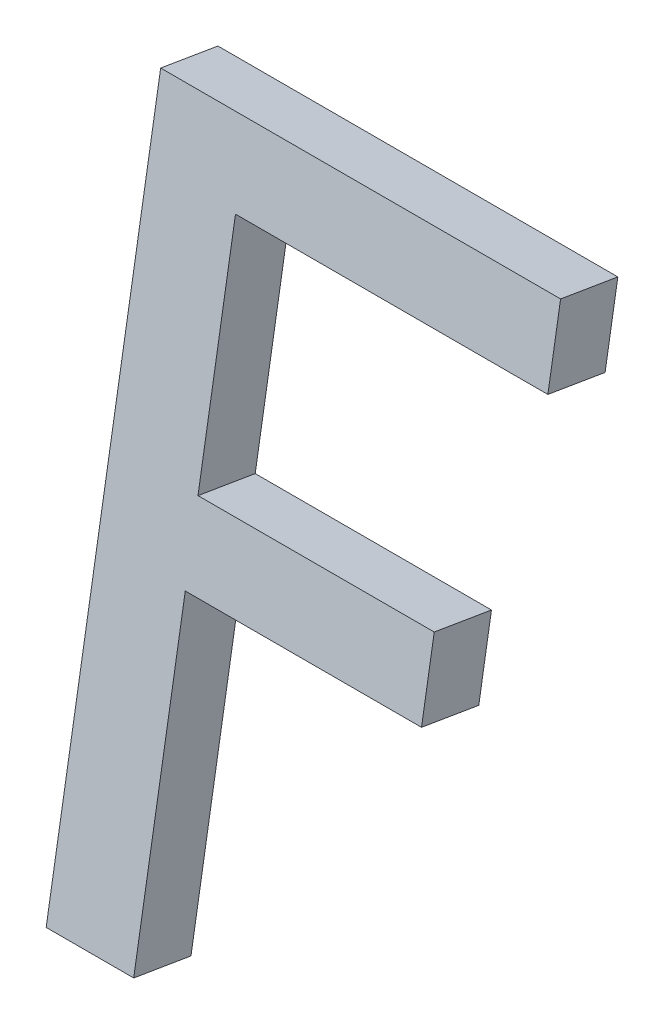
ISO-10303-21;
HEADER;
FILE_DESCRIPTION(('STEP AP214'),'2;1');
FILE_NAME('part.step','',(''),(''),'','','');
FILE_SCHEMA(('AUTOMOTIVE_DESIGN { 1 0 10303 214 1 1 1 1 }'));
ENDSEC;
DATA;
#1=APPLICATION_CONTEXT('core data for automotive mechanical design processes');
#2=APPLICATION_PROTOCOL_DEFINITION('international standard','automotive_design',2000,#1);
#3=PRODUCT_CONTEXT('',#1,'mechanical');
#4=PRODUCT('Part','Part','',(#3));
#5=PRODUCT_RELATED_PRODUCT_CATEGORY('part','',(#4));
#6=PRODUCT_DEFINITION_FORMATION('','',#4);
#7=PRODUCT_DEFINITION_CONTEXT('part definition',#1,'design');
#8=PRODUCT_DEFINITION('design','',#6,#7);
#9=PRODUCT_DEFINITION_SHAPE('','',#8);
#10=(LENGTH_UNIT() NAMED_UNIT(*) SI_UNIT(.MILLI.,.METRE.));
#11=(NAMED_UNIT(*) PLANE_ANGLE_UNIT() SI_UNIT($,.RADIAN.));
#12=(NAMED_UNIT(*) SI_UNIT($,.STERADIAN.) SOLID_ANGLE_UNIT());
#13=UNCERTAINTY_MEASURE_WITH_UNIT(LENGTH_MEASURE(1.E-05),#10,'distance_accuracy_value','');
#14=(GEOMETRIC_REPRESENTATION_CONTEXT(3) GLOBAL_UNCERTAINTY_ASSIGNED_CONTEXT((#13)) GLOBAL_UNIT_ASSIGNED_CONTEXT((#10,
#11,#12)) REPRESENTATION_CONTEXT('',''));
#15=CARTESIAN_POINT('',(0.,0.,0.));
#16=DIRECTION('',(0.,0.,1.));
#17=DIRECTION('',(1.,0.,0.));
#18=AXIS2_PLACEMENT_3D('',#15,#16,#17);
#19=CARTESIAN_POINT('',(1227.04250559284,1142.41768553082,1243.97176701001));
#20=DIRECTION('',(0.,0.986393923832144,-0.164398987305355));
#21=DIRECTION('',(0.,0.164398987305355,0.986393923832144));
#22=AXIS2_PLACEMENT_3D('',#19,#20,#21);
#23=PLANE('',#22);
#24=CARTESIAN_POINT('',(1227.04250559284,1141.5956905943,1239.03979739085));
#25=CARTESIAN_POINT('',(1236.01230425056,1141.5956905943,1239.03979739085));
#26=CARTESIAN_POINT('',(1244.98210290827,1141.5956905943,1239.03979739085));
#27=CARTESIAN_POINT('',(1253.95190156599,1141.5956905943,1239.03979739085));
#28=B_SPLINE_CURVE_WITH_KNOTS('',3,(#24,#25,#26,#27),.UNSPECIFIED.,.F.,.F.,(4,4),(0.,
0.117198004559893),.UNSPECIFIED.);
#29=CARTESIAN_POINT('',(1227.04250559284,1141.5956905943,1239.03979739085));
#30=VERTEX_POINT('',#29);
#31=CARTESIAN_POINT('',(1253.95190156599,1141.5956905943,1239.03979739085));
#32=VERTEX_POINT('',#31);
#33=EDGE_CURVE('E102',#30,#32,#28,.T.);
#34=ORIENTED_EDGE('',*,*,#33,.T.);
#35=DIRECTION('',(0.,-0.164398987305355,-0.986393923832144));
#36=VECTOR('',#35,1.);
#37=CARTESIAN_POINT('',(1253.95190156599,1142.41768553082,1243.97176701001));
#38=LINE('',#37,#36);
#39=CARTESIAN_POINT('',(1253.95190156599,1142.41768553082,1243.97176701001));
#40=VERTEX_POINT('',#39);
#41=EDGE_CURVE('E111',#40,#32,#38,.T.);
#42=ORIENTED_EDGE('',*,*,#41,.F.);
#43=CARTESIAN_POINT('',(1227.04250559284,1142.41768553082,1243.97176701001));
#44=CARTESIAN_POINT('',(1236.01230425056,1142.41768553082,1243.97176701001));
#45=CARTESIAN_POINT('',(1244.98210290827,1142.41768553082,1243.97176701001));
#46=CARTESIAN_POINT('',(1253.95190156599,1142.41768553082,1243.97176701001));
#47=B_SPLINE_CURVE_WITH_KNOTS('',3,(#43,#44,#45,#46),.UNSPECIFIED.,.F.,.F.,(4,4),(0.,
0.117198004559893),.UNSPECIFIED.);
#48=CARTESIAN_POINT('',(1227.04250559284,1142.41768553082,1243.97176701001));
#49=VERTEX_POINT('',#48);
#50=EDGE_CURVE('E116',#49,#40,#47,.T.);
#51=ORIENTED_EDGE('',*,*,#50,.F.);
#52=DIRECTION('',(0.,-0.164398987305355,-0.986393923832144));
#53=VECTOR('',#52,1.);
#54=CARTESIAN_POINT('',(1227.04250559284,1142.41768553082,1243.97176701001));
#55=LINE('',#54,#53);
#56=EDGE_CURVE('E108',#49,#30,#55,.T.);
#57=ORIENTED_EDGE('',*,*,#56,.T.);
#58=EDGE_LOOP('',(#34,#42,#51,#57));
#59=FACE_BOUND('',#58,.T.);
#60=ADVANCED_FACE('F17',(#59),#23,.F.);
#61=CARTESIAN_POINT('',(1253.95190156599,1142.41768553082,1243.97176701001));
#62=DIRECTION('',(-1.,0.,0.));
#63=DIRECTION('',(0.,0.,1.));
#64=AXIS2_PLACEMENT_3D('',#61,#62,#63);
#65=PLANE('',#64);
#66=CARTESIAN_POINT('',(1253.95190156599,1141.5956905943,1239.03979739085));
#67=CARTESIAN_POINT('',(1253.95190156599,1143.7886382785,1238.67430611015));
#68=CARTESIAN_POINT('',(1253.95190156599,1145.9815859627,1238.30881482945));
#69=CARTESIAN_POINT('',(1253.95190156599,1148.17453364691,1237.94332354875));
#70=B_SPLINE_CURVE_WITH_KNOTS('',3,(#66,#67,#68,#69),.UNSPECIFIED.,.F.,.F.,(4,4),
(0.117198004559893,0.146245949012804),.UNSPECIFIED.);
#71=CARTESIAN_POINT('',(1253.95190156599,1148.17453364691,1237.94332354875));
#72=VERTEX_POINT('',#71);
#73=EDGE_CURVE('E99',#32,#72,#70,.T.);
#74=ORIENTED_EDGE('',*,*,#73,.T.);
#75=DIRECTION('',(0.,-0.164398987305355,-0.986393923832144));
#76=VECTOR('',#75,1.);
#77=CARTESIAN_POINT('',(1253.95190156599,1148.99652858344,1242.87529316791));
#78=LINE('',#77,#76);
#79=CARTESIAN_POINT('',(1253.95190156599,1148.99652858344,1242.87529316791));
#80=VERTEX_POINT('',#79);
#81=EDGE_CURVE('E107',#80,#72,#78,.T.);
#82=ORIENTED_EDGE('',*,*,#81,.F.);
#83=CARTESIAN_POINT('',(1253.95190156599,1142.41768553082,1243.97176701001));
#84=CARTESIAN_POINT('',(1253.95190156599,1144.61063321503,1243.60627572931));
#85=CARTESIAN_POINT('',(1253.95190156599,1146.80358089923,1243.24078444861));
#86=CARTESIAN_POINT('',(1253.95190156599,1148.99652858344,1242.87529316791));
#87=B_SPLINE_CURVE_WITH_KNOTS('',3,(#83,#84,#85,#86),.UNSPECIFIED.,.F.,.F.,(4,4),
(0.117198004559893,0.146245949012804),.UNSPECIFIED.);
#88=EDGE_CURVE('E93',#40,#80,#87,.T.);
#89=ORIENTED_EDGE('',*,*,#88,.F.);
#90=ORIENTED_EDGE('',*,*,#41,.T.);
#91=EDGE_LOOP('',(#74,#82,#89,#90));
#92=FACE_BOUND('',#91,.T.);
#93=ADVANCED_FACE('F112',(#92),#65,.F.);
#94=CARTESIAN_POINT('',(1253.95190156599,1148.99652858344,1242.87529316791));
#95=DIRECTION('',(0.,-0.986393923832144,0.164398987305355));
#96=DIRECTION('',(0.,-0.164398987305355,-0.986393923832144));
#97=AXIS2_PLACEMENT_3D('',#94,#95,#96);
#98=PLANE('',#97);
#99=CARTESIAN_POINT('',(1253.95190156599,1148.17453364691,1237.94332354875));
#100=CARTESIAN_POINT('',(1242.46793437733,1148.17453364691,1237.94332354875));
#101=CARTESIAN_POINT('',(1230.98396718866,1148.17453364691,1237.94332354875));
#102=CARTESIAN_POINT('',(1219.5,1148.17453364691,1237.94332354875));
#103=B_SPLINE_CURVE_WITH_KNOTS('',3,(#99,#100,#101,#102),.UNSPECIFIED.,.F.,.F.,(4,4),
(0.146245949012804,0.296293691476315),.UNSPECIFIED.);
#104=CARTESIAN_POINT('',(1219.5,1148.17453364691,1237.94332354875));
#105=VERTEX_POINT('',#104);
#106=EDGE_CURVE('E104',#72,#105,#103,.T.);
#107=ORIENTED_EDGE('',*,*,#106,.T.);
#108=DIRECTION('',(0.,-0.164398987305355,-0.986393923832144));
#109=VECTOR('',#108,1.);
#110=CARTESIAN_POINT('',(1219.5,1148.99652858344,1242.87529316791));
#111=LINE('',#110,#109);
#112=CARTESIAN_POINT('',(1219.5,1148.99652858344,1242.87529316791));
#113=VERTEX_POINT('',#112);
#114=EDGE_CURVE('E163',#113,#105,#111,.T.);
#115=ORIENTED_EDGE('',*,*,#114,.F.);
#116=CARTESIAN_POINT('',(1253.95190156599,1148.99652858344,1242.87529316791));
#117=CARTESIAN_POINT('',(1242.46793437733,1148.99652858344,1242.87529316791));
#118=CARTESIAN_POINT('',(1230.98396718866,1148.99652858344,1242.87529316791));
#119=CARTESIAN_POINT('',(1219.5,1148.99652858344,1242.87529316791));
#120=B_SPLINE_CURVE_WITH_KNOTS('',3,(#116,#117,#118,#119),.UNSPECIFIED.,.F.,.F.,(4,4),
(0.146245949012804,0.296293691476315),.UNSPECIFIED.);
#121=EDGE_CURVE('E167',#80,#113,#120,.T.);
#122=ORIENTED_EDGE('',*,*,#121,.F.);
#123=ORIENTED_EDGE('',*,*,#81,.T.);
#124=EDGE_LOOP('',(#107,#115,#122,#123));
#125=FACE_BOUND('',#124,.T.);
#126=ADVANCED_FACE('F370',(#125),#98,.F.);
#127=CARTESIAN_POINT('',(1219.5,1148.99652858344,1242.87529316791));
#128=DIRECTION('',(1.,0.,0.));
#129=DIRECTION('',(0.,1.,0.));
#130=AXIS2_PLACEMENT_3D('',#127,#128,#129);
#131=PLANE('',#130);
#132=CARTESIAN_POINT('',(1219.5,1148.17453364691,1237.94332354875));
#133=CARTESIAN_POINT('',(1219.5,1128.44665517027,1241.23130329485));
#134=CARTESIAN_POINT('',(1219.5,1108.71877669362,1244.51928304096));
#135=CARTESIAN_POINT('',(1219.5,1088.99089821698,1247.80726278707));
#136=B_SPLINE_CURVE_WITH_KNOTS('',3,(#132,#133,#134,#135),.UNSPECIFIED.,.F.,.F.,(4,4),
(0.296293691476315,0.55761060400043),.UNSPECIFIED.);
#137=CARTESIAN_POINT('',(1219.5,1088.99089821698,1247.80726278707));
#138=VERTEX_POINT('',#137);
#139=EDGE_CURVE('E177',#105,#138,#136,.T.);
#140=ORIENTED_EDGE('',*,*,#139,.T.);
#141=DIRECTION('',(0.,-0.164398987305355,-0.986393923832144));
#142=VECTOR('',#141,1.);
#143=CARTESIAN_POINT('',(1219.5,1089.81289315351,1252.73923240623));
#144=LINE('',#143,#142);
#145=CARTESIAN_POINT('',(1219.5,1089.81289315351,1252.73923240623));
#146=VERTEX_POINT('',#145);
#147=EDGE_CURVE('E187',#146,#138,#144,.T.);
#148=ORIENTED_EDGE('',*,*,#147,.F.);
#149=CARTESIAN_POINT('',(1219.5,1148.99652858344,1242.87529316791));
#150=CARTESIAN_POINT('',(1219.5,1129.26865010679,1246.16327291401));
#151=CARTESIAN_POINT('',(1219.5,1109.54077163015,1249.45125266012));
#152=CARTESIAN_POINT('',(1219.5,1089.81289315351,1252.73923240623));
#153=B_SPLINE_CURVE_WITH_KNOTS('',3,(#149,#150,#151,#152),.UNSPECIFIED.,.F.,.F.,(4,4),
(0.296293691476315,0.55761060400043),.UNSPECIFIED.);
#154=EDGE_CURVE('E191',#113,#146,#153,.T.);
#155=ORIENTED_EDGE('',*,*,#154,.F.);
#156=ORIENTED_EDGE('',*,*,#114,.T.);
#157=EDGE_LOOP('',(#140,#148,#155,#156));
#158=FACE_BOUND('',#157,.T.);
#159=ADVANCED_FACE('F366',(#158),#131,.F.);
#160=CARTESIAN_POINT('',(1219.5,1089.81289315351,1252.73923240623));
#161=DIRECTION('',(0.,0.986393923832144,-0.164398987305355));
#162=DIRECTION('',(0.,0.164398987305355,0.986393923832144));
#163=AXIS2_PLACEMENT_3D('',#160,#161,#162);
#164=PLANE('',#163);
#165=CARTESIAN_POINT('',(1219.5,1088.99089821698,1247.80726278707));
#166=CARTESIAN_POINT('',(1222.01416853094,1088.99089821698,1247.80726278707));
#167=CARTESIAN_POINT('',(1224.52833706189,1088.99089821698,1247.80726278707));
#168=CARTESIAN_POINT('',(1227.04250559284,1088.99089821698,1247.80726278707));
#169=B_SPLINE_CURVE_WITH_KNOTS('',3,(#165,#166,#167,#168),.UNSPECIFIED.,.F.,.F.,(4,4),
(0.55761060400043,0.590460341904048),.UNSPECIFIED.);
#170=CARTESIAN_POINT('',(1227.04250559284,1088.99089821698,1247.80726278707));
#171=VERTEX_POINT('',#170);
#172=EDGE_CURVE('E201',#138,#171,#169,.T.);
#173=ORIENTED_EDGE('',*,*,#172,.T.);
#174=DIRECTION('',(0.,-0.164398987305355,-0.986393923832144));
#175=VECTOR('',#174,1.);
#176=CARTESIAN_POINT('',(1227.04250559284,1089.81289315351,1252.73923240623));
#177=LINE('',#176,#175);
#178=CARTESIAN_POINT('',(1227.04250559284,1089.81289315351,1252.73923240623));
#179=VERTEX_POINT('',#178);
#180=EDGE_CURVE('E211',#179,#171,#177,.T.);
#181=ORIENTED_EDGE('',*,*,#180,.F.);
#182=CARTESIAN_POINT('',(1219.5,1089.81289315351,1252.73923240623));
#183=CARTESIAN_POINT('',(1222.01416853094,1089.81289315351,1252.73923240623));
#184=CARTESIAN_POINT('',(1224.52833706189,1089.81289315351,1252.73923240623));
#185=CARTESIAN_POINT('',(1227.04250559284,1089.81289315351,1252.73923240623));
#186=B_SPLINE_CURVE_WITH_KNOTS('',3,(#182,#183,#184,#185),.UNSPECIFIED.,.F.,.F.,(4,4),
(0.55761060400043,0.590460341904048),.UNSPECIFIED.);
#187=EDGE_CURVE('E215',#146,#179,#186,.T.);
#188=ORIENTED_EDGE('',*,*,#187,.F.);
#189=ORIENTED_EDGE('',*,*,#147,.T.);
#190=EDGE_LOOP('',(#173,#181,#188,#189));
#191=FACE_BOUND('',#190,.T.);
#192=ADVANCED_FACE('F362',(#191),#164,.F.);
#193=CARTESIAN_POINT('',(1227.04250559284,1089.81289315351,1252.73923240623));
#194=DIRECTION('',(-1.,0.,0.));
#195=DIRECTION('',(0.,-1.,0.));
#196=AXIS2_PLACEMENT_3D('',#193,#194,#195);
#197=PLANE('',#196);
#198=CARTESIAN_POINT('',(1227.04250559284,1088.99089821698,1247.80726278707));
#199=CARTESIAN_POINT('',(1227.04250559284,1097.8751478094,1246.32655452166));
#200=CARTESIAN_POINT('',(1227.04250559284,1106.75939740182,1244.84584625626));
#201=CARTESIAN_POINT('',(1227.04250559284,1115.64364699424,1243.36513799086));
#202=B_SPLINE_CURVE_WITH_KNOTS('',3,(#198,#199,#200,#201),.UNSPECIFIED.,.F.,.F.,(4,4),
(0.590460341904048,0.708141757892764),.UNSPECIFIED.);
#203=CARTESIAN_POINT('',(1227.04250559284,1115.64364699424,1243.36513799086));
#204=VERTEX_POINT('',#203);
#205=EDGE_CURVE('E225',#171,#204,#202,.T.);
#206=ORIENTED_EDGE('',*,*,#205,.T.);
#207=DIRECTION('',(0.,-0.164398987305355,-0.986393923832144));
#208=VECTOR('',#207,1.);
#209=CARTESIAN_POINT('',(1227.04250559284,1116.46564193077,1248.29710761002));
#210=LINE('',#209,#208);
#211=CARTESIAN_POINT('',(1227.04250559284,1116.46564193077,1248.29710761002));
#212=VERTEX_POINT('',#211);
#213=EDGE_CURVE('E235',#212,#204,#210,.T.);
#214=ORIENTED_EDGE('',*,*,#213,.F.);
#215=CARTESIAN_POINT('',(1227.04250559284,1089.81289315351,1252.73923240623));
#216=CARTESIAN_POINT('',(1227.04250559284,1098.69714274593,1251.25852414083));
#217=CARTESIAN_POINT('',(1227.04250559284,1107.58139233835,1249.77781587542));
#218=CARTESIAN_POINT('',(1227.04250559284,1116.46564193077,1248.29710761002));
#219=B_SPLINE_CURVE_WITH_KNOTS('',3,(#215,#216,#217,#218),.UNSPECIFIED.,.F.,.F.,(4,4),
(0.590460341904048,0.708141757892764),.UNSPECIFIED.);
#220=EDGE_CURVE('E239',#179,#212,#219,.T.);
#221=ORIENTED_EDGE('',*,*,#220,.F.);
#222=ORIENTED_EDGE('',*,*,#180,.T.);
#223=EDGE_LOOP('',(#206,#214,#221,#222));
#224=FACE_BOUND('',#223,.T.);
#225=ADVANCED_FACE('F357',(#224),#197,.F.);
#226=CARTESIAN_POINT('',(1227.04250559284,1116.46564193077,1248.29710761002));
#227=DIRECTION('',(0.,0.986393923832144,-0.164398987305355));
#228=DIRECTION('',(0.,0.164398987305355,0.986393923832144));
#229=AXIS2_PLACEMENT_3D('',#226,#227,#228);
#230=PLANE('',#229);
#231=CARTESIAN_POINT('',(1227.04250559284,1115.64364699424,1243.36513799086));
#232=CARTESIAN_POINT('',(1233.82624906786,1115.64364699424,1243.36513799086));
#233=CARTESIAN_POINT('',(1240.60999254288,1115.64364699424,1243.36513799086));
#234=CARTESIAN_POINT('',(1247.39373601789,1115.64364699424,1243.36513799086));
#235=B_SPLINE_CURVE_WITH_KNOTS('',3,(#231,#232,#233,#234),.UNSPECIFIED.,.F.,.F.,(4,4),
(0.708141757892764,0.796777102905137),.UNSPECIFIED.);
#236=CARTESIAN_POINT('',(1247.39373601789,1115.64364699424,1243.36513799086));
#237=VERTEX_POINT('',#236);
#238=EDGE_CURVE('E249',#204,#237,#235,.T.);
#239=ORIENTED_EDGE('',*,*,#238,.T.);
#240=DIRECTION('',(0.,-0.164398987305355,-0.986393923832144));
#241=VECTOR('',#240,1.);
#242=CARTESIAN_POINT('',(1247.39373601789,1116.46564193077,1248.29710761002));
#243=LINE('',#242,#241);
#244=CARTESIAN_POINT('',(1247.39373601789,1116.46564193077,1248.29710761002));
#245=VERTEX_POINT('',#244);
#246=EDGE_CURVE('E259',#245,#237,#243,.T.);
#247=ORIENTED_EDGE('',*,*,#246,.F.);
#248=CARTESIAN_POINT('',(1227.04250559284,1116.46564193077,1248.29710761002));
#249=CARTESIAN_POINT('',(1233.82624906786,1116.46564193077,1248.29710761002));
#250=CARTESIAN_POINT('',(1240.60999254288,1116.46564193077,1248.29710761002));
#251=CARTESIAN_POINT('',(1247.39373601789,1116.46564193077,1248.29710761002));
#252=B_SPLINE_CURVE_WITH_KNOTS('',3,(#248,#249,#250,#251),.UNSPECIFIED.,.F.,.F.,(4,4),
(0.708141757892764,0.796777102905137),.UNSPECIFIED.);
#253=EDGE_CURVE('E263',#212,#245,#252,.T.);
#254=ORIENTED_EDGE('',*,*,#253,.F.);
#255=ORIENTED_EDGE('',*,*,#213,.T.);
#256=EDGE_LOOP('',(#239,#247,#254,#255));
#257=FACE_BOUND('',#256,.T.);
#258=ADVANCED_FACE('F352',(#257),#230,.F.);
#259=CARTESIAN_POINT('',(1247.39373601789,1116.46564193077,1248.29710761002));
#260=DIRECTION('',(-1.,0.,0.));
#261=DIRECTION('',(0.,0.,1.));
#262=AXIS2_PLACEMENT_3D('',#259,#260,#261);
#263=PLANE('',#262);
#264=CARTESIAN_POINT('',(1247.39373601789,1115.64364699424,1243.36513799086));
#265=CARTESIAN_POINT('',(1247.39373601789,1117.83226933784,1243.00036760026));
#266=CARTESIAN_POINT('',(1247.39373601789,1120.02089168145,1242.63559720966));
#267=CARTESIAN_POINT('',(1247.39373601789,1122.20951402505,1242.27082681906));
#268=B_SPLINE_CURVE_WITH_KNOTS('',3,(#264,#265,#266,#267),.UNSPECIFIED.,.F.,.F.,(4,4),
(0.796777102905137,0.825767753582008),.UNSPECIFIED.);
#269=CARTESIAN_POINT('',(1247.39373601789,1122.20951402505,1242.27082681906));
#270=VERTEX_POINT('',#269);
#271=EDGE_CURVE('E273',#237,#270,#268,.T.);
#272=ORIENTED_EDGE('',*,*,#271,.T.);
#273=DIRECTION('',(0.,-0.164398987305355,-0.986393923832144));
#274=VECTOR('',#273,1.);
#275=CARTESIAN_POINT('',(1247.39373601789,1123.03150896158,1247.20279643822));
#276=LINE('',#275,#274);
#277=CARTESIAN_POINT('',(1247.39373601789,1123.03150896158,1247.20279643822));
#278=VERTEX_POINT('',#277);
#279=EDGE_CURVE('E283',#278,#270,#276,.T.);
#280=ORIENTED_EDGE('',*,*,#279,.F.);
#281=CARTESIAN_POINT('',(1247.39373601789,1116.46564193077,1248.29710761002));
#282=CARTESIAN_POINT('',(1247.39373601789,1118.65426427437,1247.93233721942));
#283=CARTESIAN_POINT('',(1247.39373601789,1120.84288661797,1247.56756682882));
#284=CARTESIAN_POINT('',(1247.39373601789,1123.03150896158,1247.20279643822));
#285=B_SPLINE_CURVE_WITH_KNOTS('',3,(#281,#282,#283,#284),.UNSPECIFIED.,.F.,.F.,(4,4),
(0.796777102905137,0.825767753582008),.UNSPECIFIED.);
#286=EDGE_CURVE('E287',#245,#278,#285,.T.);
#287=ORIENTED_EDGE('',*,*,#286,.F.);
#288=ORIENTED_EDGE('',*,*,#246,.T.);
#289=EDGE_LOOP('',(#272,#280,#287,#288));
#290=FACE_BOUND('',#289,.T.);
#291=ADVANCED_FACE('F348',(#290),#263,.F.);
#292=CARTESIAN_POINT('',(1247.39373601789,1123.03150896158,1247.20279643822));
#293=DIRECTION('',(0.,-0.986393923832144,0.164398987305355));
#294=DIRECTION('',(0.,-0.164398987305355,-0.986393923832144));
#295=AXIS2_PLACEMENT_3D('',#292,#293,#294);
#296=PLANE('',#295);
#297=CARTESIAN_POINT('',(1247.39373601789,1122.20951402505,1242.27082681906));
#298=CARTESIAN_POINT('',(1240.60999254288,1122.20951402505,1242.27082681906));
#299=CARTESIAN_POINT('',(1233.82624906786,1122.20951402505,1242.27082681906));
#300=CARTESIAN_POINT('',(1227.04250559284,1122.20951402505,1242.27082681906));
#301=B_SPLINE_CURVE_WITH_KNOTS('',3,(#297,#298,#299,#300),.UNSPECIFIED.,.F.,.F.,(4,4),
(0.825767753582008,0.914403098594381),.UNSPECIFIED.);
#302=CARTESIAN_POINT('',(1227.04250559284,1122.20951402505,1242.27082681906));
#303=VERTEX_POINT('',#302);
#304=EDGE_CURVE('E297',#270,#303,#301,.T.);
#305=ORIENTED_EDGE('',*,*,#304,.T.);
#306=DIRECTION('',(0.,-0.164398987305355,-0.986393923832144));
#307=VECTOR('',#306,1.);
#308=CARTESIAN_POINT('',(1227.04250559284,1123.03150896158,1247.20279643822));
#309=LINE('',#308,#307);
#310=CARTESIAN_POINT('',(1227.04250559284,1123.03150896158,1247.20279643822));
#311=VERTEX_POINT('',#310);
#312=EDGE_CURVE('E307',#311,#303,#309,.T.);
#313=ORIENTED_EDGE('',*,*,#312,.F.);
#314=CARTESIAN_POINT('',(1247.39373601789,1123.03150896158,1247.20279643822));
#315=CARTESIAN_POINT('',(1240.60999254288,1123.03150896158,1247.20279643822));
#316=CARTESIAN_POINT('',(1233.82624906786,1123.03150896158,1247.20279643822));
#317=CARTESIAN_POINT('',(1227.04250559284,1123.03150896158,1247.20279643822));
#318=B_SPLINE_CURVE_WITH_KNOTS('',3,(#314,#315,#316,#317),.UNSPECIFIED.,.F.,.F.,(4,4),
(0.825767753582008,0.914403098594381),.UNSPECIFIED.);
#319=EDGE_CURVE('E38',#278,#311,#318,.T.);
#320=ORIENTED_EDGE('',*,*,#319,.F.);
#321=ORIENTED_EDGE('',*,*,#279,.T.);
#322=EDGE_LOOP('',(#305,#313,#320,#321));
#323=FACE_BOUND('',#322,.T.);
#324=ADVANCED_FACE('F344',(#323),#296,.F.);
#325=CARTESIAN_POINT('',(1227.04250559284,1123.03150896158,1247.20279643822));
#326=DIRECTION('',(-1.,0.,0.));
#327=DIRECTION('',(0.,0.,1.));
#328=AXIS2_PLACEMENT_3D('',#325,#326,#327);
#329=PLANE('',#328);
#330=CARTESIAN_POINT('',(1227.04250559284,1122.20951402505,1242.27082681906));
#331=CARTESIAN_POINT('',(1227.04250559284,1128.67157288147,1241.19381700965));
#332=CARTESIAN_POINT('',(1227.04250559284,1135.13363173788,1240.11680720025));
#333=CARTESIAN_POINT('',(1227.04250559284,1141.5956905943,1239.03979739085));
#334=B_SPLINE_CURVE_WITH_KNOTS('',3,(#330,#331,#332,#333),.UNSPECIFIED.,.F.,.F.,(4,4),
(0.914403098594381,1.),.UNSPECIFIED.);
#335=EDGE_CURVE('E30',#303,#30,#334,.T.);
#336=ORIENTED_EDGE('',*,*,#335,.T.);
#337=ORIENTED_EDGE('',*,*,#56,.F.);
#338=CARTESIAN_POINT('',(1227.04250559284,1123.03150896158,1247.20279643822));
#339=CARTESIAN_POINT('',(1227.04250559284,1129.49356781799,1246.12578662881));
#340=CARTESIAN_POINT('',(1227.04250559284,1135.95562667441,1245.04877681941));
#341=CARTESIAN_POINT('',(1227.04250559284,1142.41768553082,1243.97176701001));
#342=B_SPLINE_CURVE_WITH_KNOTS('',3,(#338,#339,#340,#341),.UNSPECIFIED.,.F.,.F.,(4,4),
(0.914403098594381,1.),.UNSPECIFIED.);
#343=EDGE_CURVE('E11',#311,#49,#342,.T.);
#344=ORIENTED_EDGE('',*,*,#343,.F.);
#345=ORIENTED_EDGE('',*,*,#312,.T.);
#346=EDGE_LOOP('',(#336,#337,#344,#345));
#347=FACE_BOUND('',#346,.T.);
#348=ADVANCED_FACE('F338',(#347),#329,.F.);
#349=CARTESIAN_POINT('',(1240.49720357942,1142.41768553082,1243.97176701001));
#350=DIRECTION('',(0.,-0.164398987305228,-0.986393923832165));
#351=DIRECTION('',(0.,0.986393923832165,-0.164398987305228));
#352=AXIS2_PLACEMENT_3D('',#349,#350,#351);
#353=PLANE('',#352);
#354=ORIENTED_EDGE('',*,*,#50,.T.);
#355=ORIENTED_EDGE('',*,*,#88,.T.);
#356=ORIENTED_EDGE('',*,*,#121,.T.);
#357=ORIENTED_EDGE('',*,*,#154,.T.);
#358=ORIENTED_EDGE('',*,*,#187,.T.);
#359=ORIENTED_EDGE('',*,*,#220,.T.);
#360=ORIENTED_EDGE('',*,*,#253,.T.);
#361=ORIENTED_EDGE('',*,*,#286,.T.);
#362=ORIENTED_EDGE('',*,*,#319,.T.);
#363=ORIENTED_EDGE('',*,*,#343,.T.);
#364=EDGE_LOOP('',(#354,#355,#356,#357,#358,#359,#360,#361,#362,#363));
#365=FACE_BOUND('',#364,.T.);
#366=ADVANCED_FACE('F371',(#365),#353,.F.);
#367=CARTESIAN_POINT('',(1240.49720357942,1141.5956905943,1239.03979739085));
#368=DIRECTION('',(0.,-0.164398987305228,-0.986393923832165));
#369=DIRECTION('',(0.,0.986393923832165,-0.164398987305228));
#370=AXIS2_PLACEMENT_3D('',#367,#368,#369);
#371=PLANE('',#370);
#372=ORIENTED_EDGE('',*,*,#33,.F.);
#373=ORIENTED_EDGE('',*,*,#335,.F.);
#374=ORIENTED_EDGE('',*,*,#304,.F.);
#375=ORIENTED_EDGE('',*,*,#271,.F.);
#376=ORIENTED_EDGE('',*,*,#238,.F.);
#377=ORIENTED_EDGE('',*,*,#205,.F.);
#378=ORIENTED_EDGE('',*,*,#172,.F.);
#379=ORIENTED_EDGE('',*,*,#139,.F.);
#380=ORIENTED_EDGE('',*,*,#106,.F.);
#381=ORIENTED_EDGE('',*,*,#73,.F.);
#382=EDGE_LOOP('',(#372,#373,#374,#375,#376,#377,#378,#379,#380,#381));
#383=FACE_BOUND('',#382,.T.);
#384=ADVANCED_FACE('F19',(#383),#371,.T.);
#385=CLOSED_SHELL('',(#60,#93,#126,#159,#192,#225,#258,#291,#324,#348,#366,#384));
#386=MANIFOLD_SOLID_BREP('B1',#385);
#387=ADVANCED_BREP_SHAPE_REPRESENTATION('',(#18,#386),#14);
#388=SHAPE_DEFINITION_REPRESENTATION(#9,#387);
ENDSEC;
END-ISO-10303-21;
